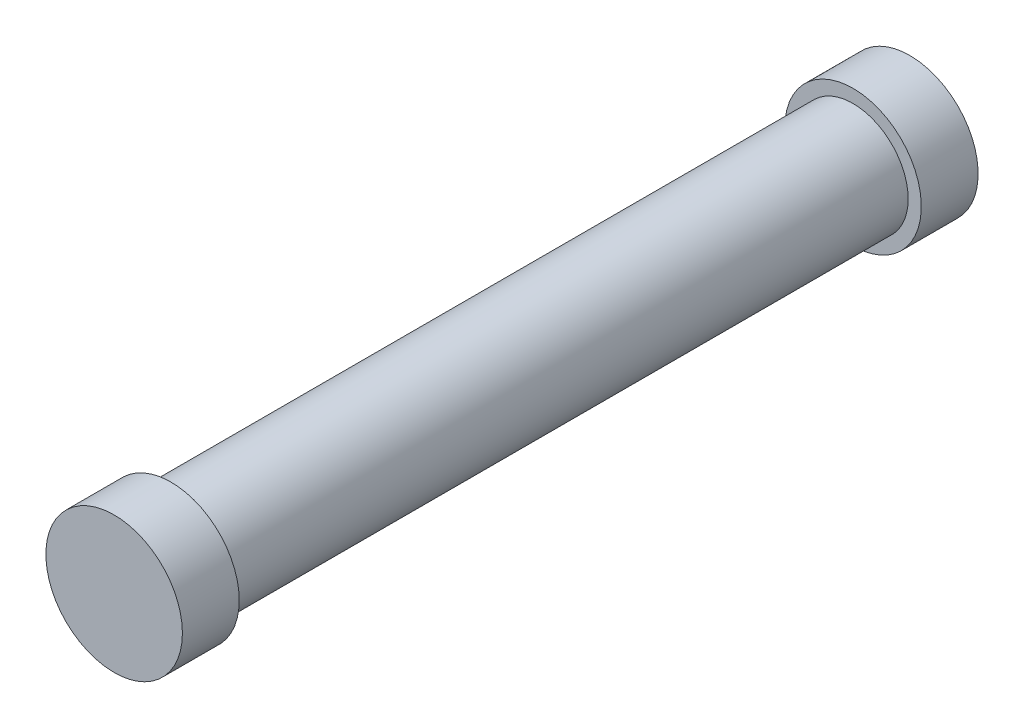
ISO-10303-21;
HEADER;
FILE_DESCRIPTION(('STEP AP214'),'2;1');
FILE_NAME('part.step','',(''),(''),'','','');
FILE_SCHEMA(('AUTOMOTIVE_DESIGN { 1 0 10303 214 1 1 1 1 }'));
ENDSEC;
DATA;
#1=APPLICATION_CONTEXT('core data for automotive mechanical design processes');
#2=APPLICATION_PROTOCOL_DEFINITION('international standard','automotive_design',2000,#1);
#3=PRODUCT_CONTEXT('',#1,'mechanical');
#4=PRODUCT('Part','Part','',(#3));
#5=PRODUCT_RELATED_PRODUCT_CATEGORY('part','',(#4));
#6=PRODUCT_DEFINITION_FORMATION('','',#4);
#7=PRODUCT_DEFINITION_CONTEXT('part definition',#1,'design');
#8=PRODUCT_DEFINITION('design','',#6,#7);
#9=PRODUCT_DEFINITION_SHAPE('','',#8);
#10=(LENGTH_UNIT() NAMED_UNIT(*) SI_UNIT(.MILLI.,.METRE.));
#11=(NAMED_UNIT(*) PLANE_ANGLE_UNIT() SI_UNIT($,.RADIAN.));
#12=(NAMED_UNIT(*) SI_UNIT($,.STERADIAN.) SOLID_ANGLE_UNIT());
#13=UNCERTAINTY_MEASURE_WITH_UNIT(LENGTH_MEASURE(1.E-05),#10,'distance_accuracy_value','');
#14=(GEOMETRIC_REPRESENTATION_CONTEXT(3) GLOBAL_UNCERTAINTY_ASSIGNED_CONTEXT((#13)) GLOBAL_UNIT_ASSIGNED_CONTEXT((#10,
#11,#12)) REPRESENTATION_CONTEXT('',''));
#15=CARTESIAN_POINT('',(0.,0.,0.));
#16=DIRECTION('',(0.,0.,1.));
#17=DIRECTION('',(1.,0.,0.));
#18=AXIS2_PLACEMENT_3D('',#15,#16,#17);
#19=CARTESIAN_POINT('',(0.,0.,36.));
#20=DIRECTION('',(0.,0.,-1.));
#21=DIRECTION('',(-1.,0.,0.));
#22=AXIS2_PLACEMENT_3D('',#19,#20,#21);
#23=CYLINDRICAL_SURFACE('',#22,2.91);
#24=CARTESIAN_POINT('',(0.,0.,36.));
#25=DIRECTION('',(0.,0.,1.));
#26=DIRECTION('',(1.,0.,0.));
#27=AXIS2_PLACEMENT_3D('',#24,#25,#26);
#28=CIRCLE('',#27,2.91);
#29=CARTESIAN_POINT('',(2.91,0.,36.));
#30=VERTEX_POINT('',#29);
#31=EDGE_CURVE('E10',#30,#30,#28,.T.);
#32=ORIENTED_EDGE('',*,*,#31,.F.);
#33=EDGE_LOOP('',(#32));
#34=FACE_BOUND('',#33,.T.);
#35=CARTESIAN_POINT('',(0.,0.,0.));
#36=DIRECTION('',(0.,0.,1.));
#37=DIRECTION('',(1.,0.,0.));
#38=AXIS2_PLACEMENT_3D('',#35,#36,#37);
#39=CIRCLE('',#38,2.91);
#40=CARTESIAN_POINT('',(2.91,0.,0.));
#41=VERTEX_POINT('',#40);
#42=EDGE_CURVE('E38',#41,#41,#39,.T.);
#43=ORIENTED_EDGE('',*,*,#42,.T.);
#44=EDGE_LOOP('',(#43));
#45=FACE_BOUND('',#44,.T.);
#46=ADVANCED_FACE('F35',(#34,#45),#23,.T.);
#47=CARTESIAN_POINT('',(0.,0.,39.));
#48=DIRECTION('',(0.,0.,-1.));
#49=DIRECTION('',(-1.,0.,0.));
#50=AXIS2_PLACEMENT_3D('',#47,#48,#49);
#51=CYLINDRICAL_SURFACE('',#50,3.6032404200241);
#52=CARTESIAN_POINT('',(0.,0.,39.));
#53=DIRECTION('',(0.,0.,1.));
#54=DIRECTION('',(1.,0.,0.));
#55=AXIS2_PLACEMENT_3D('',#52,#53,#54);
#56=CIRCLE('',#55,3.6032404200241);
#57=CARTESIAN_POINT('',(3.6032404200241,0.,39.));
#58=VERTEX_POINT('',#57);
#59=EDGE_CURVE('E42',#58,#58,#56,.T.);
#60=ORIENTED_EDGE('',*,*,#59,.F.);
#61=EDGE_LOOP('',(#60));
#62=FACE_BOUND('',#61,.T.);
#63=CARTESIAN_POINT('',(0.,0.,36.));
#64=DIRECTION('',(0.,0.,1.));
#65=DIRECTION('',(1.,0.,0.));
#66=AXIS2_PLACEMENT_3D('',#63,#64,#65);
#67=CIRCLE('',#66,3.6032404200241);
#68=CARTESIAN_POINT('',(3.6032404200241,0.,36.));
#69=VERTEX_POINT('',#68);
#70=EDGE_CURVE('E46',#69,#69,#67,.T.);
#71=ORIENTED_EDGE('',*,*,#70,.T.);
#72=EDGE_LOOP('',(#71));
#73=FACE_BOUND('',#72,.T.);
#74=ADVANCED_FACE('F83',(#62,#73),#51,.T.);
#75=CARTESIAN_POINT('',(0.,0.,39.));
#76=DIRECTION('',(0.,0.,1.));
#77=DIRECTION('',(1.,0.,0.));
#78=AXIS2_PLACEMENT_3D('',#75,#76,#77);
#79=PLANE('',#78);
#80=ORIENTED_EDGE('',*,*,#59,.T.);
#81=EDGE_LOOP('',(#80));
#82=FACE_BOUND('',#81,.T.);
#83=ADVANCED_FACE('F79',(#82),#79,.T.);
#84=CARTESIAN_POINT('',(0.,0.,36.));
#85=DIRECTION('',(0.,0.,1.));
#86=DIRECTION('',(1.,0.,0.));
#87=AXIS2_PLACEMENT_3D('',#84,#85,#86);
#88=PLANE('',#87);
#89=ORIENTED_EDGE('',*,*,#31,.T.);
#90=EDGE_LOOP('',(#89));
#91=FACE_BOUND('',#90,.T.);
#92=ORIENTED_EDGE('',*,*,#70,.F.);
#93=EDGE_LOOP('',(#92));
#94=FACE_BOUND('',#93,.T.);
#95=ADVANCED_FACE('F71',(#91,#94),#88,.F.);
#96=CARTESIAN_POINT('',(0.,0.,-3.));
#97=DIRECTION('',(0.,0.,1.));
#98=DIRECTION('',(1.,0.,0.));
#99=AXIS2_PLACEMENT_3D('',#96,#97,#98);
#100=CYLINDRICAL_SURFACE('',#99,3.6032404200241);
#101=CARTESIAN_POINT('',(0.,0.,-3.));
#102=DIRECTION('',(0.,0.,-1.));
#103=DIRECTION('',(-1.,0.,0.));
#104=AXIS2_PLACEMENT_3D('',#101,#102,#103);
#105=CIRCLE('',#104,3.6032404200241);
#106=CARTESIAN_POINT('',(-3.6032404200241,0.,-3.));
#107=VERTEX_POINT('',#106);
#108=EDGE_CURVE('E54',#107,#107,#105,.T.);
#109=ORIENTED_EDGE('',*,*,#108,.F.);
#110=EDGE_LOOP('',(#109));
#111=FACE_BOUND('',#110,.T.);
#112=CARTESIAN_POINT('',(0.,0.,0.));
#113=DIRECTION('',(0.,0.,-1.));
#114=DIRECTION('',(-1.,0.,0.));
#115=AXIS2_PLACEMENT_3D('',#112,#113,#114);
#116=CIRCLE('',#115,3.6032404200241);
#117=CARTESIAN_POINT('',(-3.6032404200241,0.,0.));
#118=VERTEX_POINT('',#117);
#119=EDGE_CURVE('E51',#118,#118,#116,.T.);
#120=ORIENTED_EDGE('',*,*,#119,.T.);
#121=EDGE_LOOP('',(#120));
#122=FACE_BOUND('',#121,.T.);
#123=ADVANCED_FACE('F69',(#111,#122),#100,.T.);
#124=CARTESIAN_POINT('',(0.,0.,-3.));
#125=DIRECTION('',(0.,0.,-1.));
#126=DIRECTION('',(-1.,0.,0.));
#127=AXIS2_PLACEMENT_3D('',#124,#125,#126);
#128=PLANE('',#127);
#129=ORIENTED_EDGE('',*,*,#108,.T.);
#130=EDGE_LOOP('',(#129));
#131=FACE_BOUND('',#130,.T.);
#132=ADVANCED_FACE('F65',(#131),#128,.T.);
#133=CARTESIAN_POINT('',(0.,0.,0.));
#134=DIRECTION('',(0.,0.,-1.));
#135=DIRECTION('',(-1.,0.,0.));
#136=AXIS2_PLACEMENT_3D('',#133,#134,#135);
#137=PLANE('',#136);
#138=ORIENTED_EDGE('',*,*,#42,.F.);
#139=EDGE_LOOP('',(#138));
#140=FACE_BOUND('',#139,.T.);
#141=ORIENTED_EDGE('',*,*,#119,.F.);
#142=EDGE_LOOP('',(#141));
#143=FACE_BOUND('',#142,.T.);
#144=ADVANCED_FACE('F62',(#140,#143),#137,.F.);
#145=CLOSED_SHELL('',(#46,#74,#83,#95,#123,#132,#144));
#146=MANIFOLD_SOLID_BREP('B2',#145);
#147=ADVANCED_BREP_SHAPE_REPRESENTATION('',(#18,#146),#14);
#148=SHAPE_DEFINITION_REPRESENTATION(#9,#147);
ENDSEC;
END-ISO-10303-21;
